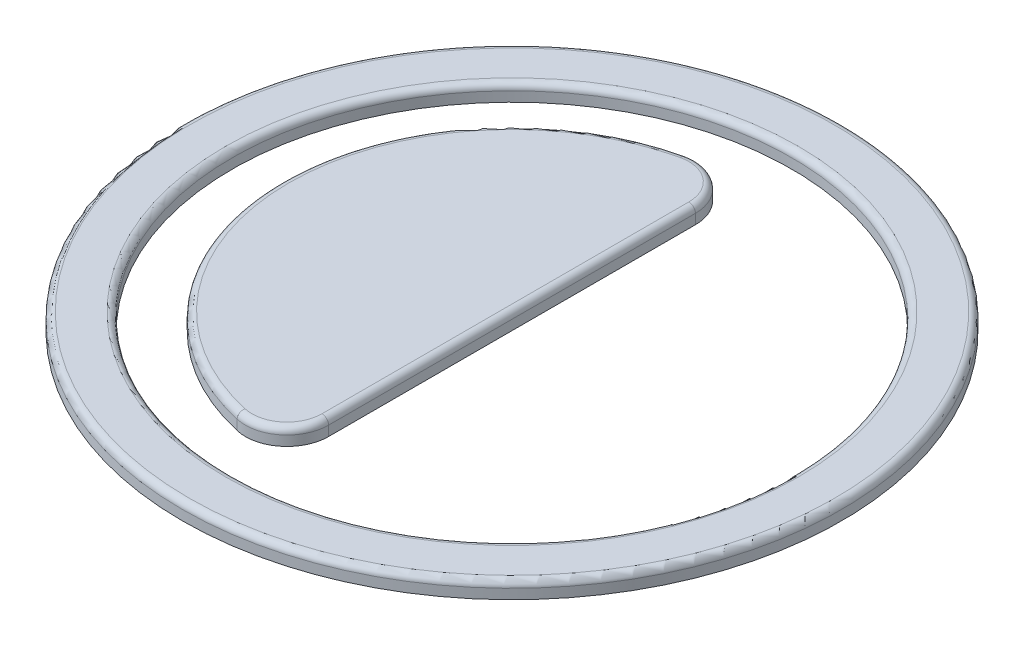
ISO-10303-21;
HEADER;
FILE_DESCRIPTION(('STEP AP214'),'2;1');
FILE_NAME('part.step','',(''),(''),'','','');
FILE_SCHEMA(('AUTOMOTIVE_DESIGN { 1 0 10303 214 1 1 1 1 }'));
ENDSEC;
DATA;
#1=APPLICATION_CONTEXT('core data for automotive mechanical design processes');
#2=APPLICATION_PROTOCOL_DEFINITION('international standard','automotive_design',2000,#1);
#3=PRODUCT_CONTEXT('',#1,'mechanical');
#4=PRODUCT('Part','Part','',(#3));
#5=PRODUCT_RELATED_PRODUCT_CATEGORY('part','',(#4));
#6=PRODUCT_DEFINITION_FORMATION('','',#4);
#7=PRODUCT_DEFINITION_CONTEXT('part definition',#1,'design');
#8=PRODUCT_DEFINITION('design','',#6,#7);
#9=PRODUCT_DEFINITION_SHAPE('','',#8);
#10=(LENGTH_UNIT() NAMED_UNIT(*) SI_UNIT(.MILLI.,.METRE.));
#11=(NAMED_UNIT(*) PLANE_ANGLE_UNIT() SI_UNIT($,.RADIAN.));
#12=(NAMED_UNIT(*) SI_UNIT($,.STERADIAN.) SOLID_ANGLE_UNIT());
#13=UNCERTAINTY_MEASURE_WITH_UNIT(LENGTH_MEASURE(1.E-05),#10,'distance_accuracy_value','');
#14=(GEOMETRIC_REPRESENTATION_CONTEXT(3) GLOBAL_UNCERTAINTY_ASSIGNED_CONTEXT((#13)) GLOBAL_UNIT_ASSIGNED_CONTEXT((#10,
#11,#12)) REPRESENTATION_CONTEXT('',''));
#15=CARTESIAN_POINT('',(0.,0.,0.));
#16=DIRECTION('',(0.,0.,1.));
#17=DIRECTION('',(1.,0.,0.));
#18=AXIS2_PLACEMENT_3D('',#15,#16,#17);
#19=CARTESIAN_POINT('',(0.,0.5,0.));
#20=DIRECTION('',(0.,-1.,0.));
#21=DIRECTION('',(0.,0.,-1.));
#22=AXIS2_PLACEMENT_3D('',#19,#20,#21);
#23=CYLINDRICAL_SURFACE('',#22,8.49026748061526);
#24=CARTESIAN_POINT('',(0.,0.3,0.));
#25=DIRECTION('',(0.,1.,0.));
#26=DIRECTION('',(0.,0.,1.));
#27=AXIS2_PLACEMENT_3D('',#24,#25,#26);
#28=CIRCLE('',#27,8.49026748061526);
#29=CARTESIAN_POINT('',(0.,0.3,8.49026748061526));
#30=VERTEX_POINT('',#29);
#31=EDGE_CURVE('E73',#30,#30,#28,.T.);
#32=ORIENTED_EDGE('',*,*,#31,.T.);
#33=EDGE_LOOP('',(#32));
#34=FACE_BOUND('',#33,.T.);
#35=CARTESIAN_POINT('',(0.,0.,0.));
#36=DIRECTION('',(0.,1.,0.));
#37=DIRECTION('',(0.,0.,1.));
#38=AXIS2_PLACEMENT_3D('',#35,#36,#37);
#39=CIRCLE('',#38,8.49026748061526);
#40=CARTESIAN_POINT('',(0.,0.,8.49026748061526));
#41=VERTEX_POINT('',#40);
#42=EDGE_CURVE('E81',#41,#41,#39,.T.);
#43=ORIENTED_EDGE('',*,*,#42,.F.);
#44=EDGE_LOOP('',(#43));
#45=FACE_BOUND('',#44,.T.);
#46=ADVANCED_FACE('F58',(#34,#45),#23,.F.);
#47=CARTESIAN_POINT('',(0.,0.5,0.));
#48=DIRECTION('',(0.,-1.,0.));
#49=DIRECTION('',(0.,0.,-1.));
#50=AXIS2_PLACEMENT_3D('',#47,#48,#49);
#51=CYLINDRICAL_SURFACE('',#50,10.);
#52=CARTESIAN_POINT('',(0.,0.3,0.));
#53=DIRECTION('',(0.,1.,0.));
#54=DIRECTION('',(0.,0.,1.));
#55=AXIS2_PLACEMENT_3D('',#52,#53,#54);
#56=CIRCLE('',#55,10.);
#57=CARTESIAN_POINT('',(0.,0.3,10.));
#58=VERTEX_POINT('',#57);
#59=EDGE_CURVE('E12',#58,#58,#56,.F.);
#60=ORIENTED_EDGE('',*,*,#59,.T.);
#61=EDGE_LOOP('',(#60));
#62=FACE_BOUND('',#61,.T.);
#63=CARTESIAN_POINT('',(0.,0.,0.));
#64=DIRECTION('',(0.,1.,0.));
#65=DIRECTION('',(0.,0.,1.));
#66=AXIS2_PLACEMENT_3D('',#63,#64,#65);
#67=CIRCLE('',#66,10.);
#68=CARTESIAN_POINT('',(0.,0.,10.));
#69=VERTEX_POINT('',#68);
#70=EDGE_CURVE('E78',#69,#69,#67,.T.);
#71=ORIENTED_EDGE('',*,*,#70,.T.);
#72=EDGE_LOOP('',(#71));
#73=FACE_BOUND('',#72,.T.);
#74=ADVANCED_FACE('F89',(#62,#73),#51,.T.);
#75=CARTESIAN_POINT('',(0.,0.5,0.));
#76=DIRECTION('',(0.,1.,0.));
#77=DIRECTION('',(0.,0.,1.));
#78=AXIS2_PLACEMENT_3D('',#75,#76,#77);
#79=PLANE('',#78);
#80=CARTESIAN_POINT('',(0.,0.5,0.));
#81=DIRECTION('',(0.,1.,0.));
#82=DIRECTION('',(0.,0.,1.));
#83=AXIS2_PLACEMENT_3D('',#80,#81,#82);
#84=CIRCLE('',#83,9.8);
#85=CARTESIAN_POINT('',(0.,0.5,9.8));
#86=VERTEX_POINT('',#85);
#87=EDGE_CURVE('E65',#86,#86,#84,.T.);
#88=ORIENTED_EDGE('',*,*,#87,.T.);
#89=EDGE_LOOP('',(#88));
#90=FACE_BOUND('',#89,.T.);
#91=CARTESIAN_POINT('',(0.,0.5,0.));
#92=DIRECTION('',(0.,1.,0.));
#93=DIRECTION('',(0.,0.,1.));
#94=AXIS2_PLACEMENT_3D('',#91,#92,#93);
#95=CIRCLE('',#94,8.69026748061526);
#96=CARTESIAN_POINT('',(0.,0.5,8.69026748061526));
#97=VERTEX_POINT('',#96);
#98=EDGE_CURVE('E69',#97,#97,#95,.F.);
#99=ORIENTED_EDGE('',*,*,#98,.T.);
#100=EDGE_LOOP('',(#99));
#101=FACE_BOUND('',#100,.T.);
#102=ADVANCED_FACE('F95',(#90,#101),#79,.T.);
#103=CARTESIAN_POINT('',(0.,0.,0.));
#104=DIRECTION('',(0.,1.,0.));
#105=DIRECTION('',(0.,0.,1.));
#106=AXIS2_PLACEMENT_3D('',#103,#104,#105);
#107=PLANE('',#106);
#108=ORIENTED_EDGE('',*,*,#42,.T.);
#109=EDGE_LOOP('',(#108));
#110=FACE_BOUND('',#109,.T.);
#111=ORIENTED_EDGE('',*,*,#70,.F.);
#112=EDGE_LOOP('',(#111));
#113=FACE_BOUND('',#112,.T.);
#114=ADVANCED_FACE('F85',(#110,#113),#107,.F.);
#115=CARTESIAN_POINT('',(0.,0.3,0.));
#116=DIRECTION('',(0.,1.,0.));
#117=DIRECTION('',(0.,0.,1.));
#118=AXIS2_PLACEMENT_3D('',#115,#116,#117);
#119=TOROIDAL_SURFACE('',#118,8.69026748061526,0.2);
#120=ORIENTED_EDGE('',*,*,#98,.F.);
#121=EDGE_LOOP('',(#120));
#122=FACE_BOUND('',#121,.T.);
#123=ORIENTED_EDGE('',*,*,#31,.F.);
#124=EDGE_LOOP('',(#123));
#125=FACE_BOUND('',#124,.T.);
#126=ADVANCED_FACE('F98',(#122,#125),#119,.T.);
#127=CARTESIAN_POINT('',(0.,0.3,0.));
#128=DIRECTION('',(0.,1.,0.));
#129=DIRECTION('',(0.,0.,1.));
#130=AXIS2_PLACEMENT_3D('',#127,#128,#129);
#131=TOROIDAL_SURFACE('',#130,9.8,0.2);
#132=ORIENTED_EDGE('',*,*,#59,.F.);
#133=EDGE_LOOP('',(#132));
#134=FACE_BOUND('',#133,.T.);
#135=ORIENTED_EDGE('',*,*,#87,.F.);
#136=EDGE_LOOP('',(#135));
#137=FACE_BOUND('',#136,.T.);
#138=ADVANCED_FACE('F60',(#134,#137),#131,.T.);
#139=CLOSED_SHELL('',(#46,#74,#102,#114,#126,#138));
#140=MANIFOLD_SOLID_BREP('B2',#139);
#141=CARTESIAN_POINT('',(-1.26262625999993,0.5,5.56564640852996));
#142=DIRECTION('',(0.,-1.,0.));
#143=DIRECTION('',(0.,0.,-1.));
#144=AXIS2_PLACEMENT_3D('',#141,#142,#143);
#145=CYLINDRICAL_SURFACE('',#144,1.26262626000004);
#146=DIRECTION('',(0.,-1.,0.));
#147=VECTOR('',#146,1.);
#148=CARTESIAN_POINT('',(0.,0.5,5.56564640853002));
#149=LINE('',#148,#147);
#150=CARTESIAN_POINT('',(0.,0.3,5.56564640853002));
#151=VERTEX_POINT('',#150);
#152=CARTESIAN_POINT('',(0.,0.,5.56564640853002));
#153=VERTEX_POINT('',#152);
#154=EDGE_CURVE('E201',#151,#153,#149,.T.);
#155=ORIENTED_EDGE('',*,*,#154,.F.);
#156=CARTESIAN_POINT('',(-1.26262625999993,0.3,5.56564640852996));
#157=DIRECTION('',(0.,1.,0.));
#158=DIRECTION('',(0.,0.,1.));
#159=AXIS2_PLACEMENT_3D('',#156,#157,#158);
#160=CIRCLE('',#159,1.26262626000004);
#161=CARTESIAN_POINT('',(-1.54196839967411,0.3,6.79698431562286));
#162=VERTEX_POINT('',#161);
#163=EDGE_CURVE('E159',#151,#162,#160,.F.);
#164=ORIENTED_EDGE('',*,*,#163,.T.);
#165=DIRECTION('',(0.,-1.,0.));
#166=VECTOR('',#165,1.);
#167=CARTESIAN_POINT('',(-1.54196839967411,0.5,6.79698431562286));
#168=LINE('',#167,#166);
#169=CARTESIAN_POINT('',(-1.54196839967411,0.,6.79698431562286));
#170=VERTEX_POINT('',#169);
#171=EDGE_CURVE('E212',#162,#170,#168,.T.);
#172=ORIENTED_EDGE('',*,*,#171,.T.);
#173=CARTESIAN_POINT('',(-1.26262625999993,0.,5.56564640852996));
#174=DIRECTION('',(0.,1.,0.));
#175=DIRECTION('',(0.,0.,1.));
#176=AXIS2_PLACEMENT_3D('',#173,#174,#175);
#177=CIRCLE('',#176,1.26262626000004);
#178=EDGE_CURVE('E211',#153,#170,#177,.F.);
#179=ORIENTED_EDGE('',*,*,#178,.F.);
#180=EDGE_LOOP('',(#155,#164,#172,#179));
#181=FACE_BOUND('',#180,.T.);
#182=ADVANCED_FACE('F150',(#181),#145,.T.);
#183=CARTESIAN_POINT('',(0.,0.5,0.));
#184=DIRECTION('',(1.,0.,0.));
#185=DIRECTION('',(0.,0.,-1.));
#186=AXIS2_PLACEMENT_3D('',#183,#184,#185);
#187=PLANE('',#186);
#188=DIRECTION('',(0.,-1.,0.));
#189=VECTOR('',#188,1.);
#190=CARTESIAN_POINT('',(0.,0.5,-5.56564640852991));
#191=LINE('',#190,#189);
#192=CARTESIAN_POINT('',(0.,0.3,-5.56564640852991));
#193=VERTEX_POINT('',#192);
#194=CARTESIAN_POINT('',(0.,0.,-5.56564640852991));
#195=VERTEX_POINT('',#194);
#196=EDGE_CURVE('E208',#193,#195,#191,.T.);
#197=ORIENTED_EDGE('',*,*,#196,.F.);
#198=DIRECTION('',(0.,0.,1.));
#199=VECTOR('',#198,1.);
#200=CARTESIAN_POINT('',(0.,0.3,0.));
#201=LINE('',#200,#199);
#202=EDGE_CURVE('E56',#193,#151,#201,.T.);
#203=ORIENTED_EDGE('',*,*,#202,.T.);
#204=ORIENTED_EDGE('',*,*,#154,.T.);
#205=DIRECTION('',(0.,0.,1.));
#206=VECTOR('',#205,1.);
#207=CARTESIAN_POINT('',(0.,0.,0.));
#208=LINE('',#207,#206);
#209=EDGE_CURVE('E205',#195,#153,#208,.T.);
#210=ORIENTED_EDGE('',*,*,#209,.F.);
#211=EDGE_LOOP('',(#197,#203,#204,#210));
#212=FACE_BOUND('',#211,.T.);
#213=ADVANCED_FACE('F203',(#212),#187,.T.);
#214=CARTESIAN_POINT('',(-1.26262626000008,0.5,-5.56564640852992));
#215=DIRECTION('',(0.,-1.,0.));
#216=DIRECTION('',(0.,0.,-1.));
#217=AXIS2_PLACEMENT_3D('',#214,#215,#216);
#218=CYLINDRICAL_SURFACE('',#217,1.26262626);
#219=DIRECTION('',(0.,-1.,0.));
#220=VECTOR('',#219,1.);
#221=CARTESIAN_POINT('',(-1.54196839967432,0.5,-6.79698431562277));
#222=LINE('',#221,#220);
#223=CARTESIAN_POINT('',(-1.54196839967432,0.3,-6.79698431562277));
#224=VERTEX_POINT('',#223);
#225=CARTESIAN_POINT('',(-1.54196839967432,0.,-6.79698431562277));
#226=VERTEX_POINT('',#225);
#227=EDGE_CURVE('E226',#224,#226,#222,.T.);
#228=ORIENTED_EDGE('',*,*,#227,.F.);
#229=CARTESIAN_POINT('',(-1.26262626000008,0.3,-5.56564640852992));
#230=DIRECTION('',(0.,1.,0.));
#231=DIRECTION('',(0.,0.,1.));
#232=AXIS2_PLACEMENT_3D('',#229,#230,#231);
#233=CIRCLE('',#232,1.26262626);
#234=EDGE_CURVE('E207',#224,#193,#233,.F.);
#235=ORIENTED_EDGE('',*,*,#234,.T.);
#236=ORIENTED_EDGE('',*,*,#196,.T.);
#237=CARTESIAN_POINT('',(-1.26262626000008,0.,-5.56564640852992));
#238=DIRECTION('',(0.,1.,0.));
#239=DIRECTION('',(0.,0.,1.));
#240=AXIS2_PLACEMENT_3D('',#237,#238,#239);
#241=CIRCLE('',#240,1.26262626);
#242=EDGE_CURVE('E219',#226,#195,#241,.F.);
#243=ORIENTED_EDGE('',*,*,#242,.F.);
#244=EDGE_LOOP('',(#228,#235,#236,#243));
#245=FACE_BOUND('',#244,.T.);
#246=ADVANCED_FACE('F270',(#245),#218,.T.);
#247=CARTESIAN_POINT('',(0.,0.5,0.));
#248=DIRECTION('',(0.,-1.,0.));
#249=DIRECTION('',(0.,0.,-1.));
#250=AXIS2_PLACEMENT_3D('',#247,#248,#249);
#251=CYLINDRICAL_SURFACE('',#250,6.96969600000005);
#252=ORIENTED_EDGE('',*,*,#171,.F.);
#253=CARTESIAN_POINT('',(0.,0.3,0.));
#254=DIRECTION('',(0.,1.,0.));
#255=DIRECTION('',(0.,0.,1.));
#256=AXIS2_PLACEMENT_3D('',#253,#254,#255);
#257=CIRCLE('',#256,6.96969600000005);
#258=EDGE_CURVE('E240',#162,#224,#257,.F.);
#259=ORIENTED_EDGE('',*,*,#258,.T.);
#260=ORIENTED_EDGE('',*,*,#227,.T.);
#261=CARTESIAN_POINT('',(0.,0.,0.));
#262=DIRECTION('',(0.,1.,0.));
#263=DIRECTION('',(0.,0.,1.));
#264=AXIS2_PLACEMENT_3D('',#261,#262,#263);
#265=CIRCLE('',#264,6.96969600000005);
#266=EDGE_CURVE('E221',#170,#226,#265,.F.);
#267=ORIENTED_EDGE('',*,*,#266,.F.);
#268=EDGE_LOOP('',(#252,#259,#260,#267));
#269=FACE_BOUND('',#268,.T.);
#270=ADVANCED_FACE('F272',(#269),#251,.T.);
#271=CARTESIAN_POINT('',(0.,0.5,0.));
#272=DIRECTION('',(0.,1.,0.));
#273=DIRECTION('',(0.,0.,1.));
#274=AXIS2_PLACEMENT_3D('',#271,#272,#273);
#275=PLANE('',#274);
#276=DIRECTION('',(0.,0.,1.));
#277=VECTOR('',#276,1.);
#278=CARTESIAN_POINT('',(-0.2,0.5,0.));
#279=LINE('',#278,#277);
#280=CARTESIAN_POINT('',(-0.199999999999917,0.5,5.56564640853001));
#281=VERTEX_POINT('',#280);
#282=CARTESIAN_POINT('',(-0.200000000000083,0.5,-5.56564640852991));
#283=VERTEX_POINT('',#282);
#284=EDGE_CURVE('E231',#281,#283,#279,.F.);
#285=ORIENTED_EDGE('',*,*,#284,.T.);
#286=CARTESIAN_POINT('',(-1.26262626000008,0.5,-5.56564640852992));
#287=DIRECTION('',(0.,1.,0.));
#288=DIRECTION('',(0.,0.,1.));
#289=AXIS2_PLACEMENT_3D('',#286,#287,#288);
#290=CIRCLE('',#289,1.06262626);
#291=CARTESIAN_POINT('',(-1.49772060465789,0.5,-6.60194039073361));
#292=VERTEX_POINT('',#291);
#293=EDGE_CURVE('E237',#283,#292,#290,.T.);
#294=ORIENTED_EDGE('',*,*,#293,.T.);
#295=CARTESIAN_POINT('',(0.,0.5,0.));
#296=DIRECTION('',(0.,1.,0.));
#297=DIRECTION('',(0.,0.,1.));
#298=AXIS2_PLACEMENT_3D('',#295,#296,#297);
#299=CIRCLE('',#298,6.76969600000005);
#300=CARTESIAN_POINT('',(-1.49772060465768,0.5,6.60194039073367));
#301=VERTEX_POINT('',#300);
#302=EDGE_CURVE('E235',#292,#301,#299,.T.);
#303=ORIENTED_EDGE('',*,*,#302,.T.);
#304=CARTESIAN_POINT('',(-1.26262625999993,0.5,5.56564640852996));
#305=DIRECTION('',(0.,1.,0.));
#306=DIRECTION('',(0.,0.,1.));
#307=AXIS2_PLACEMENT_3D('',#304,#305,#306);
#308=CIRCLE('',#307,1.06262626000004);
#309=EDGE_CURVE('E233',#301,#281,#308,.T.);
#310=ORIENTED_EDGE('',*,*,#309,.T.);
#311=EDGE_LOOP('',(#285,#294,#303,#310));
#312=FACE_BOUND('',#311,.T.);
#313=ADVANCED_FACE('F261',(#312),#275,.T.);
#314=CARTESIAN_POINT('',(0.,0.,0.));
#315=DIRECTION('',(0.,1.,0.));
#316=DIRECTION('',(0.,0.,1.));
#317=AXIS2_PLACEMENT_3D('',#314,#315,#316);
#318=PLANE('',#317);
#319=ORIENTED_EDGE('',*,*,#178,.T.);
#320=ORIENTED_EDGE('',*,*,#266,.T.);
#321=ORIENTED_EDGE('',*,*,#242,.T.);
#322=ORIENTED_EDGE('',*,*,#209,.T.);
#323=EDGE_LOOP('',(#319,#320,#321,#322));
#324=FACE_BOUND('',#323,.T.);
#325=ADVANCED_FACE('F217',(#324),#318,.F.);
#326=CARTESIAN_POINT('',(-1.26262625999993,0.3,5.56564640852996));
#327=DIRECTION('',(0.,1.,0.));
#328=DIRECTION('',(0.,0.,1.));
#329=AXIS2_PLACEMENT_3D('',#326,#327,#328);
#330=TOROIDAL_SURFACE('',#329,1.06262626000004,0.2);
#331=CARTESIAN_POINT('',(-0.199999999999883,0.3,5.56564640853001));
#332=DIRECTION('',(0.,0.,-1.));
#333=DIRECTION('',(-1.,0.,0.));
#334=AXIS2_PLACEMENT_3D('',#331,#332,#333);
#335=CIRCLE('',#334,0.2);
#336=EDGE_CURVE('E246',#281,#151,#335,.T.);
#337=ORIENTED_EDGE('',*,*,#336,.F.);
#338=ORIENTED_EDGE('',*,*,#309,.F.);
#339=CARTESIAN_POINT('',(-1.49772060465769,0.3,6.60194039073367));
#340=DIRECTION('',(-0.975219624446008,0.,-0.221238975082122));
#341=DIRECTION('',(-0.221238975082122,0.,0.975219624446008));
#342=AXIS2_PLACEMENT_3D('',#339,#340,#341);
#343=CIRCLE('',#342,0.2);
#344=EDGE_CURVE('E154',#162,#301,#343,.T.);
#345=ORIENTED_EDGE('',*,*,#344,.F.);
#346=ORIENTED_EDGE('',*,*,#163,.F.);
#347=EDGE_LOOP('',(#337,#338,#345,#346));
#348=FACE_BOUND('',#347,.T.);
#349=ADVANCED_FACE('F152',(#348),#330,.T.);
#350=CARTESIAN_POINT('',(0.,0.3,0.));
#351=DIRECTION('',(0.,1.,0.));
#352=DIRECTION('',(0.,0.,1.));
#353=AXIS2_PLACEMENT_3D('',#350,#351,#352);
#354=TOROIDAL_SURFACE('',#353,6.76969600000005,0.2);
#355=ORIENTED_EDGE('',*,*,#344,.T.);
#356=ORIENTED_EDGE('',*,*,#302,.F.);
#357=CARTESIAN_POINT('',(-1.49772060465789,0.3,-6.60194039073361));
#358=DIRECTION('',(0.975219624445996,0.,-0.221238975082173));
#359=DIRECTION('',(-0.221238975082173,0.,-0.975219624445996));
#360=AXIS2_PLACEMENT_3D('',#357,#358,#359);
#361=CIRCLE('',#360,0.2);
#362=EDGE_CURVE('E245',#224,#292,#361,.T.);
#363=ORIENTED_EDGE('',*,*,#362,.F.);
#364=ORIENTED_EDGE('',*,*,#258,.F.);
#365=EDGE_LOOP('',(#355,#356,#363,#364));
#366=FACE_BOUND('',#365,.T.);
#367=ADVANCED_FACE('F256',(#366),#354,.T.);
#368=CARTESIAN_POINT('',(-0.2,0.3,0.));
#369=DIRECTION('',(0.,0.,1.));
#370=DIRECTION('',(1.,0.,0.));
#371=AXIS2_PLACEMENT_3D('',#368,#369,#370);
#372=CYLINDRICAL_SURFACE('',#371,0.2);
#373=ORIENTED_EDGE('',*,*,#336,.T.);
#374=ORIENTED_EDGE('',*,*,#202,.F.);
#375=CARTESIAN_POINT('',(-0.200000000000083,0.3,-5.56564640852991));
#376=DIRECTION('',(0.,0.,-1.));
#377=DIRECTION('',(-1.,0.,0.));
#378=AXIS2_PLACEMENT_3D('',#375,#376,#377);
#379=CIRCLE('',#378,0.2);
#380=EDGE_CURVE('E243',#283,#193,#379,.T.);
#381=ORIENTED_EDGE('',*,*,#380,.F.);
#382=ORIENTED_EDGE('',*,*,#284,.F.);
#383=EDGE_LOOP('',(#373,#374,#381,#382));
#384=FACE_BOUND('',#383,.T.);
#385=ADVANCED_FACE('F267',(#384),#372,.T.);
#386=CARTESIAN_POINT('',(-1.26262626000008,0.3,-5.56564640852992));
#387=DIRECTION('',(0.,1.,0.));
#388=DIRECTION('',(0.,0.,1.));
#389=AXIS2_PLACEMENT_3D('',#386,#387,#388);
#390=TOROIDAL_SURFACE('',#389,1.06262626,0.2);
#391=ORIENTED_EDGE('',*,*,#362,.T.);
#392=ORIENTED_EDGE('',*,*,#293,.F.);
#393=ORIENTED_EDGE('',*,*,#380,.T.);
#394=ORIENTED_EDGE('',*,*,#234,.F.);
#395=EDGE_LOOP('',(#391,#392,#393,#394));
#396=FACE_BOUND('',#395,.T.);
#397=ADVANCED_FACE('F265',(#396),#390,.T.);
#398=CLOSED_SHELL('',(#182,#213,#246,#270,#313,#325,#349,#367,#385,#397));
#399=MANIFOLD_SOLID_BREP('B7',#398);
#400=ADVANCED_BREP_SHAPE_REPRESENTATION('',(#18,#140,#399),#14);
#401=SHAPE_DEFINITION_REPRESENTATION(#9,#400);
ENDSEC;
END-ISO-10303-21;
